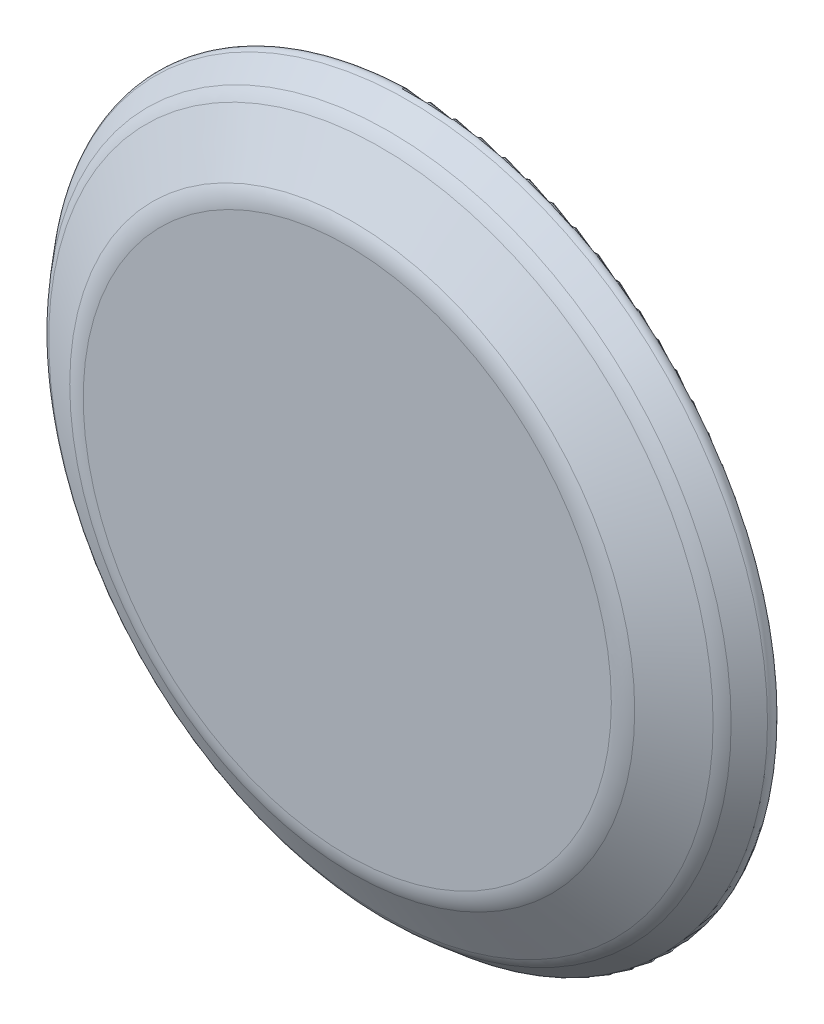
ISO-10303-21;
HEADER;
FILE_DESCRIPTION(('STEP AP214'),'2;1');
FILE_NAME('part.step','',(''),(''),'','','');
FILE_SCHEMA(('AUTOMOTIVE_DESIGN { 1 0 10303 214 1 1 1 1 }'));
ENDSEC;
DATA;
#1=APPLICATION_CONTEXT('core data for automotive mechanical design processes');
#2=APPLICATION_PROTOCOL_DEFINITION('international standard','automotive_design',2000,#1);
#3=PRODUCT_CONTEXT('',#1,'mechanical');
#4=PRODUCT('Part','Part','',(#3));
#5=PRODUCT_RELATED_PRODUCT_CATEGORY('part','',(#4));
#6=PRODUCT_DEFINITION_FORMATION('','',#4);
#7=PRODUCT_DEFINITION_CONTEXT('part definition',#1,'design');
#8=PRODUCT_DEFINITION('design','',#6,#7);
#9=PRODUCT_DEFINITION_SHAPE('','',#8);
#10=(LENGTH_UNIT() NAMED_UNIT(*) SI_UNIT(.MILLI.,.METRE.));
#11=(NAMED_UNIT(*) PLANE_ANGLE_UNIT() SI_UNIT($,.RADIAN.));
#12=(NAMED_UNIT(*) SI_UNIT($,.STERADIAN.) SOLID_ANGLE_UNIT());
#13=UNCERTAINTY_MEASURE_WITH_UNIT(LENGTH_MEASURE(1.E-05),#10,'distance_accuracy_value','');
#14=(GEOMETRIC_REPRESENTATION_CONTEXT(3) GLOBAL_UNCERTAINTY_ASSIGNED_CONTEXT((#13)) GLOBAL_UNIT_ASSIGNED_CONTEXT((#10,
#11,#12)) REPRESENTATION_CONTEXT('',''));
#15=CARTESIAN_POINT('',(0.,0.,0.));
#16=DIRECTION('',(0.,0.,1.));
#17=DIRECTION('',(1.,0.,0.));
#18=AXIS2_PLACEMENT_3D('',#15,#16,#17);
#19=CARTESIAN_POINT('',(0.,0.,0.));
#20=DIRECTION('',(0.,0.,-1.));
#21=DIRECTION('',(1.,0.,0.));
#22=AXIS2_PLACEMENT_3D('',#19,#20,#21);
#23=CONICAL_SURFACE('',#22,100.,0.698131700797733);
#24=CARTESIAN_POINT('',(0.,0.,3.28557521937306));
#25=DIRECTION('',(0.,0.,1.));
#26=DIRECTION('',(1.,0.,0.));
#27=AXIS2_PLACEMENT_3D('',#24,#25,#26);
#28=CIRCLE('',#27,97.2430750452189);
#29=CARTESIAN_POINT('',(97.2430750452189,0.,3.28557521937306));
#30=VERTEX_POINT('',#29);
#31=EDGE_CURVE('E44',#30,#30,#28,.T.);
#32=ORIENTED_EDGE('',*,*,#31,.T.);
#33=EDGE_LOOP('',(#32));
#34=FACE_BOUND('',#33,.T.);
#35=CARTESIAN_POINT('',(0.,0.,8.64925696256333));
#36=DIRECTION('',(0.,0.,1.));
#37=DIRECTION('',(1.,0.,0.));
#38=AXIS2_PLACEMENT_3D('',#35,#36,#37);
#39=CIRCLE('',#38,92.7424116727556);
#40=CARTESIAN_POINT('',(92.7424116727556,0.,8.64925696256333));
#41=VERTEX_POINT('',#40);
#42=EDGE_CURVE('E52',#41,#41,#39,.F.);
#43=ORIENTED_EDGE('',*,*,#42,.T.);
#44=EDGE_LOOP('',(#43));
#45=FACE_BOUND('',#44,.T.);
#46=ADVANCED_FACE('F37',(#34,#45),#23,.T.);
#47=CARTESIAN_POINT('',(0.,0.,0.));
#48=DIRECTION('',(0.,0.,1.));
#49=DIRECTION('',(1.,0.,0.));
#50=AXIS2_PLACEMENT_3D('',#47,#48,#49);
#51=PLANE('',#50);
#52=CARTESIAN_POINT('',(0.,0.,0.));
#53=DIRECTION('',(0.,0.,1.));
#54=DIRECTION('',(1.,0.,0.));
#55=AXIS2_PLACEMENT_3D('',#52,#53,#54);
#56=CIRCLE('',#55,93.4729635533386);
#57=CARTESIAN_POINT('',(93.4729635533386,0.,0.));
#58=VERTEX_POINT('',#57);
#59=EDGE_CURVE('E63',#58,#58,#56,.T.);
#60=ORIENTED_EDGE('',*,*,#59,.T.);
#61=EDGE_LOOP('',(#60));
#62=FACE_BOUND('',#61,.T.);
#63=CARTESIAN_POINT('',(0.,0.,0.));
#64=DIRECTION('',(0.,0.,1.));
#65=DIRECTION('',(1.,0.,0.));
#66=AXIS2_PLACEMENT_3D('',#63,#64,#65);
#67=CIRCLE('',#66,95.7109861589809);
#68=CARTESIAN_POINT('',(95.7109861589809,0.,0.));
#69=VERTEX_POINT('',#68);
#70=EDGE_CURVE('E10',#69,#69,#67,.F.);
#71=ORIENTED_EDGE('',*,*,#70,.T.);
#72=EDGE_LOOP('',(#71));
#73=FACE_BOUND('',#72,.T.);
#74=ADVANCED_FACE('F99',(#62,#73),#51,.F.);
#75=CARTESIAN_POINT('',(0.,0.,10.));
#76=DIRECTION('',(0.,0.,-1.));
#77=DIRECTION('',(1.,0.,0.));
#78=AXIS2_PLACEMENT_3D('',#75,#76,#77);
#79=CONICAL_SURFACE('',#78,91.6090036882272,1.0471975511966);
#80=CARTESIAN_POINT('',(0.,0.,10.8816349035423));
#81=DIRECTION('',(0.,0.,1.));
#82=DIRECTION('',(1.,0.,0.));
#83=AXIS2_PLACEMENT_3D('',#80,#81,#82);
#84=CIRCLE('',#83,90.0819672415658);
#85=CARTESIAN_POINT('',(90.0819672415658,0.,10.8816349035423));
#86=VERTEX_POINT('',#85);
#87=EDGE_CURVE('E57',#86,#86,#84,.T.);
#88=ORIENTED_EDGE('',*,*,#87,.T.);
#89=EDGE_LOOP('',(#88));
#90=FACE_BOUND('',#89,.T.);
#91=CARTESIAN_POINT('',(0.,0.,18.6602540378444));
#92=DIRECTION('',(0.,0.,-1.));
#93=DIRECTION('',(-1.,0.,0.));
#94=AXIS2_PLACEMENT_3D('',#91,#92,#93);
#95=CIRCLE('',#94,76.6090036882271);
#96=CARTESIAN_POINT('',(-76.6090036882271,0.,18.6602540378444));
#97=VERTEX_POINT('',#96);
#98=EDGE_CURVE('E60',#97,#97,#95,.T.);
#99=ORIENTED_EDGE('',*,*,#98,.T.);
#100=EDGE_LOOP('',(#99));
#101=FACE_BOUND('',#100,.T.);
#102=ADVANCED_FACE('F104',(#90,#101),#79,.T.);
#103=CARTESIAN_POINT('',(0.,0.,20.));
#104=DIRECTION('',(0.,0.,1.));
#105=DIRECTION('',(1.,0.,0.));
#106=AXIS2_PLACEMENT_3D('',#103,#104,#105);
#107=PLANE('',#106);
#108=CARTESIAN_POINT('',(0.,0.,20.));
#109=DIRECTION('',(0.,0.,1.));
#110=DIRECTION('',(1.,0.,0.));
#111=AXIS2_PLACEMENT_3D('',#108,#109,#110);
#112=CIRCLE('',#111,71.6090036882271);
#113=CARTESIAN_POINT('',(71.6090036882271,0.,20.));
#114=VERTEX_POINT('',#113);
#115=EDGE_CURVE('E48',#114,#114,#112,.T.);
#116=ORIENTED_EDGE('',*,*,#115,.T.);
#117=EDGE_LOOP('',(#116));
#118=FACE_BOUND('',#117,.T.);
#119=ADVANCED_FACE('F112',(#118),#107,.T.);
#120=CARTESIAN_POINT('',(0.,0.,2.22138086569794));
#121=DIRECTION('',(0.,0.,-1.));
#122=DIRECTION('',(-1.,0.,0.));
#123=AXIS2_PLACEMENT_3D('',#120,#121,#122);
#124=TOROIDAL_SURFACE('',#123,85.0819672415658,10.);
#125=ORIENTED_EDGE('',*,*,#42,.F.);
#126=EDGE_LOOP('',(#125));
#127=FACE_BOUND('',#126,.T.);
#128=ORIENTED_EDGE('',*,*,#87,.F.);
#129=EDGE_LOOP('',(#128));
#130=FACE_BOUND('',#129,.T.);
#131=ADVANCED_FACE('F110',(#127,#130),#124,.T.);
#132=CARTESIAN_POINT('',(0.,0.,10.));
#133=DIRECTION('',(0.,0.,1.));
#134=DIRECTION('',(1.,0.,0.));
#135=AXIS2_PLACEMENT_3D('',#132,#133,#134);
#136=TOROIDAL_SURFACE('',#135,71.6090036882271,10.);
#137=ORIENTED_EDGE('',*,*,#98,.F.);
#138=EDGE_LOOP('',(#137));
#139=FACE_BOUND('',#138,.T.);
#140=ORIENTED_EDGE('',*,*,#115,.F.);
#141=EDGE_LOOP('',(#140));
#142=FACE_BOUND('',#141,.T.);
#143=ADVANCED_FACE('F95',(#139,#142),#136,.T.);
#144=CARTESIAN_POINT('',(0.,0.,2.));
#145=DIRECTION('',(0.,0.,1.));
#146=DIRECTION('',(1.,0.,0.));
#147=AXIS2_PLACEMENT_3D('',#144,#145,#146);
#148=TOROIDAL_SURFACE('',#147,95.7109861589809,2.);
#149=ORIENTED_EDGE('',*,*,#70,.F.);
#150=EDGE_LOOP('',(#149));
#151=FACE_BOUND('',#150,.T.);
#152=ORIENTED_EDGE('',*,*,#31,.F.);
#153=EDGE_LOOP('',(#152));
#154=FACE_BOUND('',#153,.T.);
#155=ADVANCED_FACE('F39',(#151,#154),#148,.T.);
#156=CARTESIAN_POINT('',(0.,0.,-3.2139380484327));
#157=DIRECTION('',(0.,0.,-1.));
#158=DIRECTION('',(1.,0.,0.));
#159=AXIS2_PLACEMENT_3D('',#156,#157,#158);
#160=CONICAL_SURFACE('',#159,96.1697777844051,0.698131700797733);
#161=ORIENTED_EDGE('',*,*,#59,.F.);
#162=EDGE_LOOP('',(#161));
#163=FACE_BOUND('',#162,.T.);
#164=CARTESIAN_POINT('',(0.,0.,5.43531891413063));
#165=DIRECTION('',(0.,0.,-1.));
#166=DIRECTION('',(-1.,0.,0.));
#167=AXIS2_PLACEMENT_3D('',#164,#165,#166);
#168=CIRCLE('',#167,88.9121894571607);
#169=CARTESIAN_POINT('',(-88.9121894571607,0.,5.43531891413063));
#170=VERTEX_POINT('',#169);
#171=EDGE_CURVE('E69',#170,#170,#168,.T.);
#172=ORIENTED_EDGE('',*,*,#171,.F.);
#173=EDGE_LOOP('',(#172));
#174=FACE_BOUND('',#173,.T.);
#175=ADVANCED_FACE('F82',(#163,#174),#160,.F.);
#176=CARTESIAN_POINT('',(0.,0.,5.6698729810778));
#177=DIRECTION('',(0.,0.,-1.));
#178=DIRECTION('',(1.,0.,0.));
#179=AXIS2_PLACEMENT_3D('',#176,#177,#178);
#180=CONICAL_SURFACE('',#179,89.1090036882272,1.0471975511966);
#181=CARTESIAN_POINT('',(0.,0.,6.55150788462013));
#182=DIRECTION('',(0.,0.,-1.));
#183=DIRECTION('',(-1.,0.,0.));
#184=AXIS2_PLACEMENT_3D('',#181,#182,#183);
#185=CIRCLE('',#184,87.5819672415658);
#186=CARTESIAN_POINT('',(-87.5819672415658,0.,6.55150788462013));
#187=VERTEX_POINT('',#186);
#188=EDGE_CURVE('E73',#187,#187,#185,.F.);
#189=ORIENTED_EDGE('',*,*,#188,.F.);
#190=EDGE_LOOP('',(#189));
#191=FACE_BOUND('',#190,.T.);
#192=CARTESIAN_POINT('',(0.,0.,14.3301270189222));
#193=DIRECTION('',(0.,0.,-1.));
#194=DIRECTION('',(-1.,0.,0.));
#195=AXIS2_PLACEMENT_3D('',#192,#193,#194);
#196=CIRCLE('',#195,74.1090036882271);
#197=CARTESIAN_POINT('',(-74.1090036882271,0.,14.3301270189222));
#198=VERTEX_POINT('',#197);
#199=EDGE_CURVE('E70',#198,#198,#196,.T.);
#200=ORIENTED_EDGE('',*,*,#199,.F.);
#201=EDGE_LOOP('',(#200));
#202=FACE_BOUND('',#201,.T.);
#203=ADVANCED_FACE('F84',(#191,#202),#180,.F.);
#204=CARTESIAN_POINT('',(0.,0.,15.));
#205=DIRECTION('',(0.,0.,1.));
#206=DIRECTION('',(1.,0.,0.));
#207=AXIS2_PLACEMENT_3D('',#204,#205,#206);
#208=PLANE('',#207);
#209=CARTESIAN_POINT('',(0.,0.,15.));
#210=DIRECTION('',(0.,0.,1.));
#211=DIRECTION('',(1.,0.,0.));
#212=AXIS2_PLACEMENT_3D('',#209,#210,#211);
#213=CIRCLE('',#212,71.6090036882271);
#214=CARTESIAN_POINT('',(71.6090036882271,0.,15.));
#215=VERTEX_POINT('',#214);
#216=EDGE_CURVE('E66',#215,#215,#213,.T.);
#217=ORIENTED_EDGE('',*,*,#216,.F.);
#218=EDGE_LOOP('',(#217));
#219=FACE_BOUND('',#218,.T.);
#220=ADVANCED_FACE('F91',(#219),#208,.F.);
#221=CARTESIAN_POINT('',(0.,0.,2.22138086569794));
#222=DIRECTION('',(0.,0.,-1.));
#223=DIRECTION('',(-1.,0.,0.));
#224=AXIS2_PLACEMENT_3D('',#221,#222,#223);
#225=TOROIDAL_SURFACE('',#224,85.0819672415658,5.);
#226=ORIENTED_EDGE('',*,*,#171,.T.);
#227=EDGE_LOOP('',(#226));
#228=FACE_BOUND('',#227,.T.);
#229=ORIENTED_EDGE('',*,*,#188,.T.);
#230=EDGE_LOOP('',(#229));
#231=FACE_BOUND('',#230,.T.);
#232=ADVANCED_FACE('F79',(#228,#231),#225,.F.);
#233=CARTESIAN_POINT('',(0.,0.,10.));
#234=DIRECTION('',(0.,0.,1.));
#235=DIRECTION('',(1.,0.,0.));
#236=AXIS2_PLACEMENT_3D('',#233,#234,#235);
#237=TOROIDAL_SURFACE('',#236,71.6090036882271,5.);
#238=ORIENTED_EDGE('',*,*,#199,.T.);
#239=EDGE_LOOP('',(#238));
#240=FACE_BOUND('',#239,.T.);
#241=ORIENTED_EDGE('',*,*,#216,.T.);
#242=EDGE_LOOP('',(#241));
#243=FACE_BOUND('',#242,.T.);
#244=ADVANCED_FACE('F128',(#240,#243),#237,.F.);
#245=CLOSED_SHELL('',(#46,#74,#102,#119,#131,#143,#155,#175,#203,#220,#232,#244));
#246=MANIFOLD_SOLID_BREP('B2',#245);
#247=ADVANCED_BREP_SHAPE_REPRESENTATION('',(#18,#246),#14);
#248=SHAPE_DEFINITION_REPRESENTATION(#9,#247);
ENDSEC;
END-ISO-10303-21;
